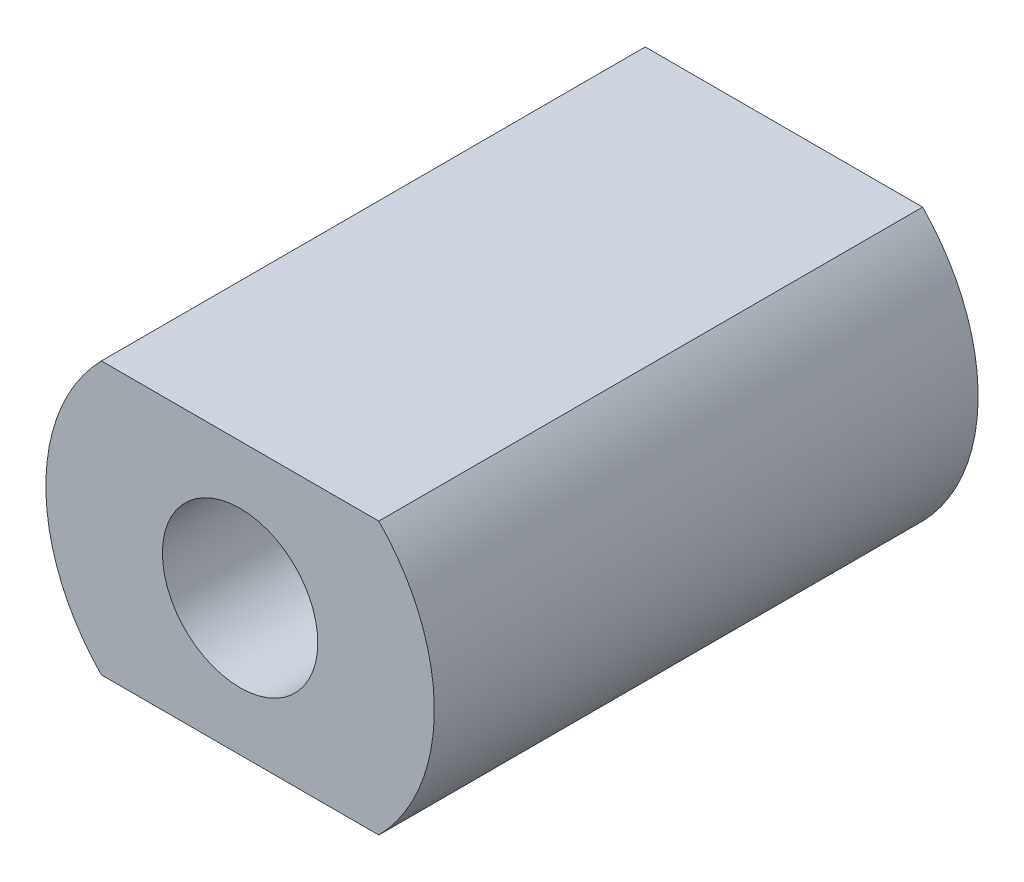
ISO-10303-21;
HEADER;
FILE_DESCRIPTION(('STEP AP214'),'2;1');
FILE_NAME('part.step','',(''),(''),'','','');
FILE_SCHEMA(('AUTOMOTIVE_DESIGN { 1 0 10303 214 1 1 1 1 }'));
ENDSEC;
DATA;
#1=APPLICATION_CONTEXT('core data for automotive mechanical design processes');
#2=APPLICATION_PROTOCOL_DEFINITION('international standard','automotive_design',2000,#1);
#3=PRODUCT_CONTEXT('',#1,'mechanical');
#4=PRODUCT('Part','Part','',(#3));
#5=PRODUCT_RELATED_PRODUCT_CATEGORY('part','',(#4));
#6=PRODUCT_DEFINITION_FORMATION('','',#4);
#7=PRODUCT_DEFINITION_CONTEXT('part definition',#1,'design');
#8=PRODUCT_DEFINITION('design','',#6,#7);
#9=PRODUCT_DEFINITION_SHAPE('','',#8);
#10=(LENGTH_UNIT() NAMED_UNIT(*) SI_UNIT(.MILLI.,.METRE.));
#11=(NAMED_UNIT(*) PLANE_ANGLE_UNIT() SI_UNIT($,.RADIAN.));
#12=(NAMED_UNIT(*) SI_UNIT($,.STERADIAN.) SOLID_ANGLE_UNIT());
#13=UNCERTAINTY_MEASURE_WITH_UNIT(LENGTH_MEASURE(1.E-05),#10,'distance_accuracy_value','');
#14=(GEOMETRIC_REPRESENTATION_CONTEXT(3) GLOBAL_UNCERTAINTY_ASSIGNED_CONTEXT((#13)) GLOBAL_UNIT_ASSIGNED_CONTEXT((#10,
#11,#12)) REPRESENTATION_CONTEXT('',''));
#15=CARTESIAN_POINT('',(0.,0.,0.));
#16=DIRECTION('',(0.,0.,1.));
#17=DIRECTION('',(1.,0.,0.));
#18=AXIS2_PLACEMENT_3D('',#15,#16,#17);
#19=CARTESIAN_POINT('',(0.,0.,7.));
#20=DIRECTION('',(0.,0.,1.));
#21=DIRECTION('',(1.,0.,0.));
#22=AXIS2_PLACEMENT_3D('',#19,#20,#21);
#23=PLANE('',#22);
#24=CARTESIAN_POINT('',(0.,0.,7.));
#25=DIRECTION('',(0.,0.,1.));
#26=DIRECTION('',(1.,0.,0.));
#27=AXIS2_PLACEMENT_3D('',#24,#25,#26);
#28=CIRCLE('',#27,2.5);
#29=CARTESIAN_POINT('',(-1.78535710713571,1.75,7.));
#30=VERTEX_POINT('',#29);
#31=CARTESIAN_POINT('',(-1.78535710713571,-1.75,7.));
#32=VERTEX_POINT('',#31);
#33=EDGE_CURVE('E93',#30,#32,#28,.T.);
#34=ORIENTED_EDGE('',*,*,#33,.T.);
#35=DIRECTION('',(1.,0.,0.));
#36=VECTOR('',#35,1.);
#37=CARTESIAN_POINT('',(-1.78535710713571,-1.75,7.));
#38=LINE('',#37,#36);
#39=CARTESIAN_POINT('',(1.78535710713571,-1.75,7.));
#40=VERTEX_POINT('',#39);
#41=EDGE_CURVE('E88',#32,#40,#38,.T.);
#42=ORIENTED_EDGE('',*,*,#41,.T.);
#43=CARTESIAN_POINT('',(0.,0.,7.));
#44=DIRECTION('',(0.,0.,1.));
#45=DIRECTION('',(1.,0.,0.));
#46=AXIS2_PLACEMENT_3D('',#43,#44,#45);
#47=CIRCLE('',#46,2.5);
#48=CARTESIAN_POINT('',(1.78535710713571,1.75,7.));
#49=VERTEX_POINT('',#48);
#50=EDGE_CURVE('E91',#40,#49,#47,.T.);
#51=ORIENTED_EDGE('',*,*,#50,.T.);
#52=DIRECTION('',(-1.,0.,0.));
#53=VECTOR('',#52,1.);
#54=CARTESIAN_POINT('',(-1.78535710713571,1.75,7.));
#55=LINE('',#54,#53);
#56=EDGE_CURVE('E58',#49,#30,#55,.T.);
#57=ORIENTED_EDGE('',*,*,#56,.T.);
#58=EDGE_LOOP('',(#34,#42,#51,#57));
#59=FACE_BOUND('',#58,.T.);
#60=CARTESIAN_POINT('',(0.,0.,7.));
#61=DIRECTION('',(0.,0.,1.));
#62=DIRECTION('',(1.,0.,0.));
#63=AXIS2_PLACEMENT_3D('',#60,#61,#62);
#64=CIRCLE('',#63,1.);
#65=CARTESIAN_POINT('',(1.,0.,7.));
#66=VERTEX_POINT('',#65);
#67=EDGE_CURVE('E108',#66,#66,#64,.T.);
#68=ORIENTED_EDGE('',*,*,#67,.F.);
#69=EDGE_LOOP('',(#68));
#70=FACE_BOUND('',#69,.T.);
#71=ADVANCED_FACE('F41',(#59,#70),#23,.T.);
#72=CARTESIAN_POINT('',(0.,0.,0.));
#73=DIRECTION('',(0.,0.,1.));
#74=DIRECTION('',(1.,0.,0.));
#75=AXIS2_PLACEMENT_3D('',#72,#73,#74);
#76=PLANE('',#75);
#77=CARTESIAN_POINT('',(0.,0.,0.));
#78=DIRECTION('',(0.,0.,1.));
#79=DIRECTION('',(1.,0.,0.));
#80=AXIS2_PLACEMENT_3D('',#77,#78,#79);
#81=CIRCLE('',#80,2.5);
#82=CARTESIAN_POINT('',(-1.78535710713571,1.75,0.));
#83=VERTEX_POINT('',#82);
#84=CARTESIAN_POINT('',(-1.78535710713571,-1.75,0.));
#85=VERTEX_POINT('',#84);
#86=EDGE_CURVE('E105',#83,#85,#81,.T.);
#87=ORIENTED_EDGE('',*,*,#86,.F.);
#88=DIRECTION('',(-1.,0.,0.));
#89=VECTOR('',#88,1.);
#90=CARTESIAN_POINT('',(-1.78535710713571,1.75,0.));
#91=LINE('',#90,#89);
#92=CARTESIAN_POINT('',(1.78535710713571,1.75,0.));
#93=VERTEX_POINT('',#92);
#94=EDGE_CURVE('E81',#93,#83,#91,.T.);
#95=ORIENTED_EDGE('',*,*,#94,.F.);
#96=CARTESIAN_POINT('',(0.,0.,0.));
#97=DIRECTION('',(0.,0.,1.));
#98=DIRECTION('',(1.,0.,0.));
#99=AXIS2_PLACEMENT_3D('',#96,#97,#98);
#100=CIRCLE('',#99,2.5);
#101=CARTESIAN_POINT('',(1.78535710713571,-1.75,0.));
#102=VERTEX_POINT('',#101);
#103=EDGE_CURVE('E75',#102,#93,#100,.T.);
#104=ORIENTED_EDGE('',*,*,#103,.F.);
#105=DIRECTION('',(1.,0.,0.));
#106=VECTOR('',#105,1.);
#107=CARTESIAN_POINT('',(-1.78535710713571,-1.75,0.));
#108=LINE('',#107,#106);
#109=EDGE_CURVE('E97',#85,#102,#108,.T.);
#110=ORIENTED_EDGE('',*,*,#109,.F.);
#111=EDGE_LOOP('',(#87,#95,#104,#110));
#112=FACE_BOUND('',#111,.T.);
#113=CARTESIAN_POINT('',(0.,0.,0.));
#114=DIRECTION('',(0.,0.,1.));
#115=DIRECTION('',(1.,0.,0.));
#116=AXIS2_PLACEMENT_3D('',#113,#114,#115);
#117=CIRCLE('',#116,1.);
#118=CARTESIAN_POINT('',(1.,0.,0.));
#119=VERTEX_POINT('',#118);
#120=EDGE_CURVE('E120',#119,#119,#117,.T.);
#121=ORIENTED_EDGE('',*,*,#120,.T.);
#122=EDGE_LOOP('',(#121));
#123=FACE_BOUND('',#122,.T.);
#124=ADVANCED_FACE('F116',(#112,#123),#76,.F.);
#125=CARTESIAN_POINT('',(0.,0.,7.));
#126=DIRECTION('',(0.,0.,-1.));
#127=DIRECTION('',(-1.,0.,0.));
#128=AXIS2_PLACEMENT_3D('',#125,#126,#127);
#129=CYLINDRICAL_SURFACE('',#128,2.5);
#130=ORIENTED_EDGE('',*,*,#86,.T.);
#131=DIRECTION('',(0.,0.,-1.));
#132=VECTOR('',#131,1.);
#133=CARTESIAN_POINT('',(-1.78535710713571,-1.75,7.));
#134=LINE('',#133,#132);
#135=EDGE_CURVE('E11',#32,#85,#134,.T.);
#136=ORIENTED_EDGE('',*,*,#135,.F.);
#137=ORIENTED_EDGE('',*,*,#33,.F.);
#138=DIRECTION('',(0.,0.,-1.));
#139=VECTOR('',#138,1.);
#140=CARTESIAN_POINT('',(-1.78535710713571,1.75,7.));
#141=LINE('',#140,#139);
#142=EDGE_CURVE('E101',#30,#83,#141,.T.);
#143=ORIENTED_EDGE('',*,*,#142,.T.);
#144=EDGE_LOOP('',(#130,#136,#137,#143));
#145=FACE_BOUND('',#144,.T.);
#146=ADVANCED_FACE('F43',(#145),#129,.T.);
#147=CARTESIAN_POINT('',(-1.78535710713571,-1.75,7.));
#148=DIRECTION('',(0.,1.,0.));
#149=DIRECTION('',(0.,0.,1.));
#150=AXIS2_PLACEMENT_3D('',#147,#148,#149);
#151=PLANE('',#150);
#152=ORIENTED_EDGE('',*,*,#109,.T.);
#153=DIRECTION('',(0.,0.,-1.));
#154=VECTOR('',#153,1.);
#155=CARTESIAN_POINT('',(1.78535710713571,-1.75,7.));
#156=LINE('',#155,#154);
#157=EDGE_CURVE('E50',#40,#102,#156,.T.);
#158=ORIENTED_EDGE('',*,*,#157,.F.);
#159=ORIENTED_EDGE('',*,*,#41,.F.);
#160=ORIENTED_EDGE('',*,*,#135,.T.);
#161=EDGE_LOOP('',(#152,#158,#159,#160));
#162=FACE_BOUND('',#161,.T.);
#163=ADVANCED_FACE('F96',(#162),#151,.F.);
#164=CARTESIAN_POINT('',(0.,0.,7.));
#165=DIRECTION('',(0.,0.,-1.));
#166=DIRECTION('',(-1.,0.,0.));
#167=AXIS2_PLACEMENT_3D('',#164,#165,#166);
#168=CYLINDRICAL_SURFACE('',#167,2.5);
#169=ORIENTED_EDGE('',*,*,#103,.T.);
#170=DIRECTION('',(0.,0.,-1.));
#171=VECTOR('',#170,1.);
#172=CARTESIAN_POINT('',(1.78535710713571,1.75,7.));
#173=LINE('',#172,#171);
#174=EDGE_CURVE('E98',#49,#93,#173,.T.);
#175=ORIENTED_EDGE('',*,*,#174,.F.);
#176=ORIENTED_EDGE('',*,*,#50,.F.);
#177=ORIENTED_EDGE('',*,*,#157,.T.);
#178=EDGE_LOOP('',(#169,#175,#176,#177));
#179=FACE_BOUND('',#178,.T.);
#180=ADVANCED_FACE('F99',(#179),#168,.T.);
#181=CARTESIAN_POINT('',(-1.78535710713571,1.75,7.));
#182=DIRECTION('',(0.,-1.,0.));
#183=DIRECTION('',(0.,0.,-1.));
#184=AXIS2_PLACEMENT_3D('',#181,#182,#183);
#185=PLANE('',#184);
#186=ORIENTED_EDGE('',*,*,#94,.T.);
#187=ORIENTED_EDGE('',*,*,#142,.F.);
#188=ORIENTED_EDGE('',*,*,#56,.F.);
#189=ORIENTED_EDGE('',*,*,#174,.T.);
#190=EDGE_LOOP('',(#186,#187,#188,#189));
#191=FACE_BOUND('',#190,.T.);
#192=ADVANCED_FACE('F113',(#191),#185,.F.);
#193=CARTESIAN_POINT('',(0.,0.,7.));
#194=DIRECTION('',(0.,0.,-1.));
#195=DIRECTION('',(-1.,0.,0.));
#196=AXIS2_PLACEMENT_3D('',#193,#194,#195);
#197=CYLINDRICAL_SURFACE('',#196,1.);
#198=ORIENTED_EDGE('',*,*,#67,.T.);
#199=EDGE_LOOP('',(#198));
#200=FACE_BOUND('',#199,.T.);
#201=ORIENTED_EDGE('',*,*,#120,.F.);
#202=EDGE_LOOP('',(#201));
#203=FACE_BOUND('',#202,.T.);
#204=ADVANCED_FACE('F126',(#200,#203),#197,.F.);
#205=CLOSED_SHELL('',(#71,#124,#146,#163,#180,#192,#204));
#206=MANIFOLD_SOLID_BREP('B2',#205);
#207=ADVANCED_BREP_SHAPE_REPRESENTATION('',(#18,#206),#14);
#208=SHAPE_DEFINITION_REPRESENTATION(#9,#207);
ENDSEC;
END-ISO-10303-21;
